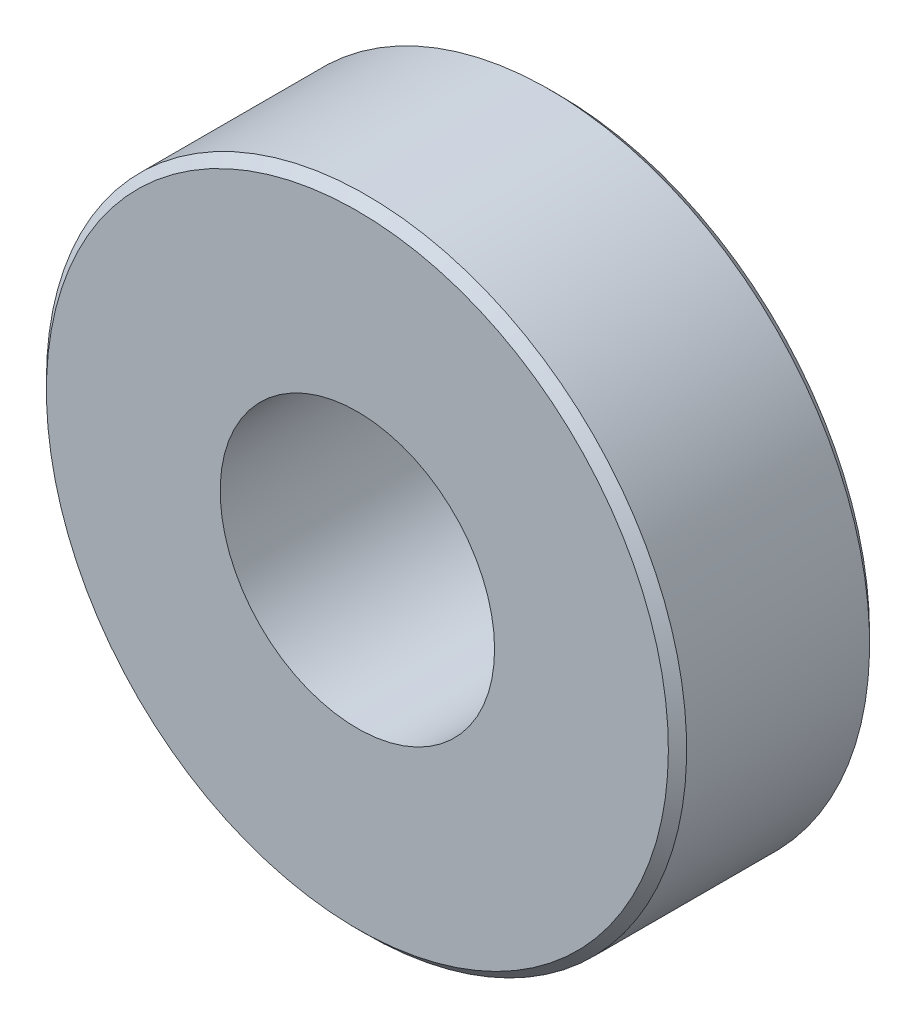
ISO-10303-21;
HEADER;
FILE_DESCRIPTION(('STEP AP214'),'2;1');
FILE_NAME('part.step','',(''),(''),'','','');
FILE_SCHEMA(('AUTOMOTIVE_DESIGN { 1 0 10303 214 1 1 1 1 }'));
ENDSEC;
DATA;
#1=APPLICATION_CONTEXT('core data for automotive mechanical design processes');
#2=APPLICATION_PROTOCOL_DEFINITION('international standard','automotive_design',2000,#1);
#3=PRODUCT_CONTEXT('',#1,'mechanical');
#4=PRODUCT('Part','Part','',(#3));
#5=PRODUCT_RELATED_PRODUCT_CATEGORY('part','',(#4));
#6=PRODUCT_DEFINITION_FORMATION('','',#4);
#7=PRODUCT_DEFINITION_CONTEXT('part definition',#1,'design');
#8=PRODUCT_DEFINITION('design','',#6,#7);
#9=PRODUCT_DEFINITION_SHAPE('','',#8);
#10=(LENGTH_UNIT() NAMED_UNIT(*) SI_UNIT(.MILLI.,.METRE.));
#11=(NAMED_UNIT(*) PLANE_ANGLE_UNIT() SI_UNIT($,.RADIAN.));
#12=(NAMED_UNIT(*) SI_UNIT($,.STERADIAN.) SOLID_ANGLE_UNIT());
#13=UNCERTAINTY_MEASURE_WITH_UNIT(LENGTH_MEASURE(1.E-05),#10,'distance_accuracy_value','');
#14=(GEOMETRIC_REPRESENTATION_CONTEXT(3) GLOBAL_UNCERTAINTY_ASSIGNED_CONTEXT((#13)) GLOBAL_UNIT_ASSIGNED_CONTEXT((#10,
#11,#12)) REPRESENTATION_CONTEXT('',''));
#15=CARTESIAN_POINT('',(0.,0.,0.));
#16=DIRECTION('',(0.,0.,1.));
#17=DIRECTION('',(1.,0.,0.));
#18=AXIS2_PLACEMENT_3D('',#15,#16,#17);
#19=CARTESIAN_POINT('',(-0.0195470693560484,0.0021960919807713,35.2922710574948));
#20=DIRECTION('',(0.,0.,1.));
#21=DIRECTION('',(0.,-1.,0.));
#22=AXIS2_PLACEMENT_3D('',#19,#20,#21);
#23=CYLINDRICAL_SURFACE('',#22,17.5);
#24=CARTESIAN_POINT('',(-0.0195470693560484,0.0021960919807713,45.7922710574948));
#25=DIRECTION('',(0.,0.,-1.));
#26=DIRECTION('',(0.383049008063238,-0.923728021347068,0.));
#27=AXIS2_PLACEMENT_3D('',#24,#25,#26);
#28=CIRCLE('',#27,17.5);
#29=CARTESIAN_POINT('',(6.68381057175061,-16.163044281593,45.7922710574948));
#30=VERTEX_POINT('',#29);
#31=EDGE_CURVE('E11',#30,#30,#28,.T.);
#32=ORIENTED_EDGE('',*,*,#31,.T.);
#33=EDGE_LOOP('',(#32));
#34=FACE_BOUND('',#33,.T.);
#35=CARTESIAN_POINT('',(-0.0195470693560484,0.0021960919807713,35.7922710574948));
#36=DIRECTION('',(0.,0.,1.));
#37=DIRECTION('',(0.383049008063238,-0.923728021347068,0.));
#38=AXIS2_PLACEMENT_3D('',#35,#36,#37);
#39=CIRCLE('',#38,17.5);
#40=CARTESIAN_POINT('',(6.68381057175061,-16.163044281593,35.7922710574948));
#41=VERTEX_POINT('',#40);
#42=EDGE_CURVE('E27',#41,#41,#39,.T.);
#43=ORIENTED_EDGE('',*,*,#42,.T.);
#44=EDGE_LOOP('',(#43));
#45=FACE_BOUND('',#44,.T.);
#46=ADVANCED_FACE('F17',(#34,#45),#23,.T.);
#47=CARTESIAN_POINT('',(-0.0195470693560484,0.0021960919807713,35.2922710574948));
#48=DIRECTION('',(0.,0.,1.));
#49=DIRECTION('',(0.,-1.,0.));
#50=AXIS2_PLACEMENT_3D('',#47,#48,#49);
#51=CYLINDRICAL_SURFACE('',#50,7.5);
#52=CARTESIAN_POINT('',(-0.0195470693560484,0.0021960919807713,35.2922710574948));
#53=DIRECTION('',(0.,0.,-1.));
#54=DIRECTION('',(-0.383049008063238,0.923728021347068,0.));
#55=AXIS2_PLACEMENT_3D('',#52,#53,#54);
#56=CIRCLE('',#55,7.5);
#57=CARTESIAN_POINT('',(-2.89241462983033,6.93015625208378,35.2922710574948));
#58=VERTEX_POINT('',#57);
#59=EDGE_CURVE('E52',#58,#58,#56,.T.);
#60=ORIENTED_EDGE('',*,*,#59,.T.);
#61=EDGE_LOOP('',(#60));
#62=FACE_BOUND('',#61,.T.);
#63=CARTESIAN_POINT('',(-0.0195470693560484,0.0021960919807713,46.2922710574948));
#64=DIRECTION('',(0.,0.,-1.));
#65=DIRECTION('',(-0.383049008063238,0.923728021347068,0.));
#66=AXIS2_PLACEMENT_3D('',#63,#64,#65);
#67=CIRCLE('',#66,7.5);
#68=CARTESIAN_POINT('',(-2.89241462983033,6.93015625208378,46.2922710574948));
#69=VERTEX_POINT('',#68);
#70=EDGE_CURVE('E51',#69,#69,#67,.T.);
#71=ORIENTED_EDGE('',*,*,#70,.F.);
#72=EDGE_LOOP('',(#71));
#73=FACE_BOUND('',#72,.T.);
#74=ADVANCED_FACE('F69',(#62,#73),#51,.F.);
#75=CARTESIAN_POINT('',(-0.0195470693560484,0.0021960919807713,35.2922710574948));
#76=DIRECTION('',(0.,0.,1.));
#77=DIRECTION('',(0.383049008063238,-0.923728021347068,0.));
#78=AXIS2_PLACEMENT_3D('',#75,#76,#77);
#79=PLANE('',#78);
#80=CARTESIAN_POINT('',(-0.0195470693560484,0.0021960919807713,35.2922710574948));
#81=DIRECTION('',(0.,0.,-1.));
#82=DIRECTION('',(0.383049008063238,-0.923728021347068,0.));
#83=AXIS2_PLACEMENT_3D('',#80,#81,#82);
#84=CIRCLE('',#83,17.);
#85=CARTESIAN_POINT('',(6.49228606771899,-15.7011802709194,35.2922710574948));
#86=VERTEX_POINT('',#85);
#87=EDGE_CURVE('E45',#86,#86,#84,.T.);
#88=ORIENTED_EDGE('',*,*,#87,.T.);
#89=EDGE_LOOP('',(#88));
#90=FACE_BOUND('',#89,.T.);
#91=ORIENTED_EDGE('',*,*,#59,.F.);
#92=EDGE_LOOP('',(#91));
#93=FACE_BOUND('',#92,.T.);
#94=ADVANCED_FACE('F75',(#90,#93),#79,.F.);
#95=CARTESIAN_POINT('',(-0.0195470693560484,0.0021960919807713,46.2922710574948));
#96=DIRECTION('',(0.,0.,1.));
#97=DIRECTION('',(0.383049008063238,-0.923728021347068,0.));
#98=AXIS2_PLACEMENT_3D('',#95,#96,#97);
#99=PLANE('',#98);
#100=CARTESIAN_POINT('',(-0.0195470693560484,0.0021960919807713,46.2922710574948));
#101=DIRECTION('',(0.,0.,1.));
#102=DIRECTION('',(0.383049008063238,-0.923728021347068,0.));
#103=AXIS2_PLACEMENT_3D('',#100,#101,#102);
#104=CIRCLE('',#103,17.);
#105=CARTESIAN_POINT('',(6.49228606771899,-15.7011802709194,46.2922710574948));
#106=VERTEX_POINT('',#105);
#107=EDGE_CURVE('E21',#106,#106,#104,.T.);
#108=ORIENTED_EDGE('',*,*,#107,.T.);
#109=EDGE_LOOP('',(#108));
#110=FACE_BOUND('',#109,.T.);
#111=ORIENTED_EDGE('',*,*,#70,.T.);
#112=EDGE_LOOP('',(#111));
#113=FACE_BOUND('',#112,.T.);
#114=ADVANCED_FACE('F67',(#110,#113),#99,.T.);
#115=CARTESIAN_POINT('',(-0.0195470693560484,0.0021960919807713,46.2922710574948));
#116=DIRECTION('',(0.,0.,-1.));
#117=DIRECTION('',(0.383049008063238,-0.923728021347068,0.));
#118=AXIS2_PLACEMENT_3D('',#115,#116,#117);
#119=CONICAL_SURFACE('',#118,17.,0.785398163397448);
#120=ORIENTED_EDGE('',*,*,#31,.F.);
#121=EDGE_LOOP('',(#120));
#122=FACE_BOUND('',#121,.T.);
#123=ORIENTED_EDGE('',*,*,#107,.F.);
#124=EDGE_LOOP('',(#123));
#125=FACE_BOUND('',#124,.T.);
#126=ADVANCED_FACE('F49',(#122,#125),#119,.T.);
#127=CARTESIAN_POINT('',(-0.0195470693560484,0.0021960919807713,35.7922710574948));
#128=DIRECTION('',(0.,0.,1.));
#129=DIRECTION('',(-0.383049008063238,0.923728021347068,0.));
#130=AXIS2_PLACEMENT_3D('',#127,#128,#129);
#131=CONICAL_SURFACE('',#130,17.5,0.785398163397448);
#132=ORIENTED_EDGE('',*,*,#87,.F.);
#133=EDGE_LOOP('',(#132));
#134=FACE_BOUND('',#133,.T.);
#135=ORIENTED_EDGE('',*,*,#42,.F.);
#136=EDGE_LOOP('',(#135));
#137=FACE_BOUND('',#136,.T.);
#138=ADVANCED_FACE('F19',(#134,#137),#131,.T.);
#139=CLOSED_SHELL('',(#46,#74,#94,#114,#126,#138));
#140=MANIFOLD_SOLID_BREP('B1',#139);
#141=ADVANCED_BREP_SHAPE_REPRESENTATION('',(#18,#140),#14);
#142=SHAPE_DEFINITION_REPRESENTATION(#9,#141);
ENDSEC;
END-ISO-10303-21;
